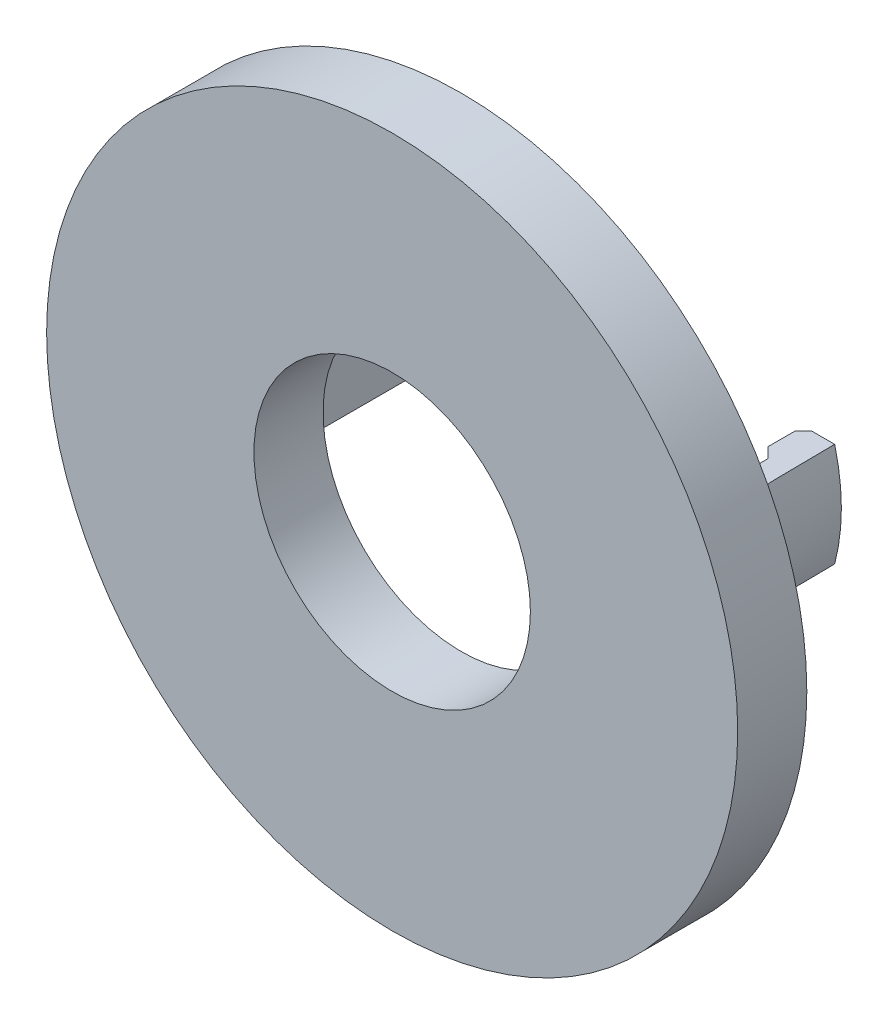
ISO-10303-21;
HEADER;
FILE_DESCRIPTION(('STEP AP214'),'2;1');
FILE_NAME('part.step','',(''),(''),'','','');
FILE_SCHEMA(('AUTOMOTIVE_DESIGN { 1 0 10303 214 1 1 1 1 }'));
ENDSEC;
DATA;
#1=APPLICATION_CONTEXT('core data for automotive mechanical design processes');
#2=APPLICATION_PROTOCOL_DEFINITION('international standard','automotive_design',2000,#1);
#3=PRODUCT_CONTEXT('',#1,'mechanical');
#4=PRODUCT('Part','Part','',(#3));
#5=PRODUCT_RELATED_PRODUCT_CATEGORY('part','',(#4));
#6=PRODUCT_DEFINITION_FORMATION('','',#4);
#7=PRODUCT_DEFINITION_CONTEXT('part definition',#1,'design');
#8=PRODUCT_DEFINITION('design','',#6,#7);
#9=PRODUCT_DEFINITION_SHAPE('','',#8);
#10=(LENGTH_UNIT() NAMED_UNIT(*) SI_UNIT(.MILLI.,.METRE.));
#11=(NAMED_UNIT(*) PLANE_ANGLE_UNIT() SI_UNIT($,.RADIAN.));
#12=(NAMED_UNIT(*) SI_UNIT($,.STERADIAN.) SOLID_ANGLE_UNIT());
#13=UNCERTAINTY_MEASURE_WITH_UNIT(LENGTH_MEASURE(1.E-05),#10,'distance_accuracy_value','');
#14=(GEOMETRIC_REPRESENTATION_CONTEXT(3) GLOBAL_UNCERTAINTY_ASSIGNED_CONTEXT((#13)) GLOBAL_UNIT_ASSIGNED_CONTEXT((#10,
#11,#12)) REPRESENTATION_CONTEXT('',''));
#15=CARTESIAN_POINT('',(0.,0.,0.));
#16=DIRECTION('',(0.,0.,1.));
#17=DIRECTION('',(1.,0.,0.));
#18=AXIS2_PLACEMENT_3D('',#15,#16,#17);
#19=CARTESIAN_POINT('',(0.,0.,0.));
#20=DIRECTION('',(0.,0.,1.));
#21=DIRECTION('',(1.,0.,0.));
#22=AXIS2_PLACEMENT_3D('',#19,#20,#21);
#23=PLANE('',#22);
#24=DIRECTION('',(1.,0.,0.));
#25=VECTOR('',#24,1.);
#26=CARTESIAN_POINT('',(0.,3.75,0.));
#27=LINE('',#26,#25);
#28=CARTESIAN_POINT('',(-15.039531242695,3.75,0.));
#29=VERTEX_POINT('',#28);
#30=CARTESIAN_POINT('',(-10.3535533905933,3.75,0.));
#31=VERTEX_POINT('',#30);
#32=EDGE_CURVE('E160',#29,#31,#27,.T.);
#33=ORIENTED_EDGE('',*,*,#32,.F.);
#34=CARTESIAN_POINT('',(0.,0.,0.));
#35=DIRECTION('',(0.,0.,-1.));
#36=DIRECTION('',(-1.,0.,0.));
#37=AXIS2_PLACEMENT_3D('',#34,#35,#36);
#38=CIRCLE('',#37,15.5);
#39=CARTESIAN_POINT('',(-15.039531242695,-3.75,0.));
#40=VERTEX_POINT('',#39);
#41=EDGE_CURVE('E150',#40,#29,#38,.T.);
#42=ORIENTED_EDGE('',*,*,#41,.F.);
#43=DIRECTION('',(1.,0.,0.));
#44=VECTOR('',#43,1.);
#45=CARTESIAN_POINT('',(0.,-3.75,0.));
#46=LINE('',#45,#44);
#47=CARTESIAN_POINT('',(-10.3535533905933,-3.75,0.));
#48=VERTEX_POINT('',#47);
#49=EDGE_CURVE('E192',#40,#48,#46,.T.);
#50=ORIENTED_EDGE('',*,*,#49,.T.);
#51=DIRECTION('',(0.,1.,0.));
#52=VECTOR('',#51,1.);
#53=CARTESIAN_POINT('',(-10.3535533905933,-3.75,0.));
#54=LINE('',#53,#52);
#55=EDGE_CURVE('E174',#48,#31,#54,.T.);
#56=ORIENTED_EDGE('',*,*,#55,.T.);
#57=EDGE_LOOP('',(#33,#42,#50,#56));
#58=FACE_BOUND('',#57,.T.);
#59=CARTESIAN_POINT('',(0.,0.,0.));
#60=DIRECTION('',(0.,0.,1.));
#61=DIRECTION('',(1.,0.,0.));
#62=AXIS2_PLACEMENT_3D('',#59,#60,#61);
#63=CIRCLE('',#62,15.5);
#64=CARTESIAN_POINT('',(15.039531242695,-3.75,0.));
#65=VERTEX_POINT('',#64);
#66=CARTESIAN_POINT('',(15.039531242695,3.74999999999999,0.));
#67=VERTEX_POINT('',#66);
#68=EDGE_CURVE('E256',#65,#67,#63,.T.);
#69=ORIENTED_EDGE('',*,*,#68,.T.);
#70=DIRECTION('',(-1.,0.,0.));
#71=VECTOR('',#70,1.);
#72=CARTESIAN_POINT('',(0.,3.75,0.));
#73=LINE('',#72,#71);
#74=CARTESIAN_POINT('',(10.3535533905933,3.75,0.));
#75=VERTEX_POINT('',#74);
#76=EDGE_CURVE('E50',#67,#75,#73,.T.);
#77=ORIENTED_EDGE('',*,*,#76,.T.);
#78=DIRECTION('',(0.,1.,0.));
#79=VECTOR('',#78,1.);
#80=CARTESIAN_POINT('',(10.3535533905933,-3.75,0.));
#81=LINE('',#80,#79);
#82=CARTESIAN_POINT('',(10.3535533905933,-3.75,0.));
#83=VERTEX_POINT('',#82);
#84=EDGE_CURVE('E516',#83,#75,#81,.T.);
#85=ORIENTED_EDGE('',*,*,#84,.F.);
#86=DIRECTION('',(-1.,0.,0.));
#87=VECTOR('',#86,1.);
#88=CARTESIAN_POINT('',(0.,-3.75,0.));
#89=LINE('',#88,#87);
#90=EDGE_CURVE('E58',#65,#83,#89,.T.);
#91=ORIENTED_EDGE('',*,*,#90,.F.);
#92=EDGE_LOOP('',(#69,#77,#85,#91));
#93=FACE_BOUND('',#92,.T.);
#94=CARTESIAN_POINT('',(0.,0.,0.));
#95=DIRECTION('',(0.,0.,1.));
#96=DIRECTION('',(1.,0.,0.));
#97=AXIS2_PLACEMENT_3D('',#94,#95,#96);
#98=CIRCLE('',#97,25.);
#99=CARTESIAN_POINT('',(25.,0.,0.));
#100=VERTEX_POINT('',#99);
#101=EDGE_CURVE('E39',#100,#100,#98,.T.);
#102=ORIENTED_EDGE('',*,*,#101,.F.);
#103=EDGE_LOOP('',(#102));
#104=FACE_BOUND('',#103,.T.);
#105=CARTESIAN_POINT('',(0.,0.,0.));
#106=DIRECTION('',(0.,0.,1.));
#107=DIRECTION('',(1.,0.,0.));
#108=AXIS2_PLACEMENT_3D('',#105,#106,#107);
#109=CIRCLE('',#108,10.);
#110=CARTESIAN_POINT('',(10.,0.,0.));
#111=VERTEX_POINT('',#110);
#112=EDGE_CURVE('E509',#111,#111,#109,.T.);
#113=ORIENTED_EDGE('',*,*,#112,.T.);
#114=EDGE_LOOP('',(#113));
#115=FACE_BOUND('',#114,.T.);
#116=ADVANCED_FACE('F35',(#58,#93,#104,#115),#23,.F.);
#117=CARTESIAN_POINT('',(0.,-3.75,-12.75));
#118=DIRECTION('',(0.,0.,1.));
#119=DIRECTION('',(1.,0.,0.));
#120=AXIS2_PLACEMENT_3D('',#117,#118,#119);
#121=PLANE('',#120);
#122=DIRECTION('',(1.,0.,0.));
#123=VECTOR('',#122,1.);
#124=CARTESIAN_POINT('',(0.,3.75,-12.75));
#125=LINE('',#124,#123);
#126=CARTESIAN_POINT('',(12.6035533905933,3.75,-12.75));
#127=VERTEX_POINT('',#126);
#128=CARTESIAN_POINT('',(14.2653426176871,3.75,-12.75));
#129=VERTEX_POINT('',#128);
#130=EDGE_CURVE('E560',#127,#129,#125,.T.);
#131=ORIENTED_EDGE('',*,*,#130,.T.);
#132=CARTESIAN_POINT('',(0.,0.,-12.75));
#133=DIRECTION('',(0.,0.,1.));
#134=DIRECTION('',(1.,0.,0.));
#135=AXIS2_PLACEMENT_3D('',#132,#133,#134);
#136=CIRCLE('',#135,14.75);
#137=CARTESIAN_POINT('',(14.2653426176871,-3.75,-12.75));
#138=VERTEX_POINT('',#137);
#139=EDGE_CURVE('E213',#138,#129,#136,.T.);
#140=ORIENTED_EDGE('',*,*,#139,.F.);
#141=DIRECTION('',(1.,0.,0.));
#142=VECTOR('',#141,1.);
#143=CARTESIAN_POINT('',(0.,-3.75,-12.75));
#144=LINE('',#143,#142);
#145=CARTESIAN_POINT('',(12.6035533905933,-3.75,-12.75));
#146=VERTEX_POINT('',#145);
#147=EDGE_CURVE('E542',#146,#138,#144,.T.);
#148=ORIENTED_EDGE('',*,*,#147,.F.);
#149=DIRECTION('',(0.,1.,0.));
#150=VECTOR('',#149,1.);
#151=CARTESIAN_POINT('',(12.6035533905933,-3.75,-12.75));
#152=LINE('',#151,#150);
#153=EDGE_CURVE('E519',#146,#127,#152,.T.);
#154=ORIENTED_EDGE('',*,*,#153,.T.);
#155=EDGE_LOOP('',(#131,#140,#148,#154));
#156=FACE_BOUND('',#155,.T.);
#157=ADVANCED_FACE('F262',(#156),#121,.F.);
#158=CARTESIAN_POINT('',(0.,-3.75,0.));
#159=DIRECTION('',(0.,1.,0.));
#160=DIRECTION('',(0.,0.,1.));
#161=AXIS2_PLACEMENT_3D('',#158,#159,#160);
#162=PLANE('',#161);
#163=ORIENTED_EDGE('',*,*,#147,.T.);
#164=CARTESIAN_POINT('',(14.2653426176871,-3.75,-12.75));
#165=CARTESIAN_POINT('',(14.2653500910361,-3.75,-12.3961589505586));
#166=CARTESIAN_POINT('',(14.2661845081766,-3.75,-12.0423166032924));
#167=CARTESIAN_POINT('',(14.2697384971241,-3.75,-11.3346108956683));
#168=CARTESIAN_POINT('',(14.2724582324036,-3.75,-10.9807475361491));
#169=CARTESIAN_POINT('',(14.2800143207087,-3.75,-10.273031792079));
#170=CARTESIAN_POINT('',(14.2848507393399,-3.75,-9.91917940820826));
#171=CARTESIAN_POINT('',(14.2969507670398,-3.75,-9.21074937713185));
#172=CARTESIAN_POINT('',(14.3042196059621,-3.75,-8.85617181753099));
#173=CARTESIAN_POINT('',(14.3215540726288,-3.75,-8.14709279050959));
#174=CARTESIAN_POINT('',(14.3316196330507,-3.75,-7.79259132146296));
#175=CARTESIAN_POINT('',(14.355023351933,-3.75,-7.08369823996048));
#176=CARTESIAN_POINT('',(14.3683614684173,-3.75000000000002,-6.72930662615393));
#177=CARTESIAN_POINT('',(14.3913224155745,-3.75000000000001,-6.19733566895319));
#178=CARTESIAN_POINT('',(14.3994822113355,-3.75,-6.01969270757438));
#179=CARTESIAN_POINT('',(14.416887413724,-3.75,-5.66446084663767));
#180=CARTESIAN_POINT('',(14.4261328128766,-3.75,-5.48687194671597));
#181=CARTESIAN_POINT('',(14.4458265073767,-3.75,-5.13176386300203));
#182=CARTESIAN_POINT('',(14.4562747806969,-3.75,-4.95424467799288));
#183=CARTESIAN_POINT('',(14.4785066127611,-3.75,-4.59943269605847));
#184=CARTESIAN_POINT('',(14.4902890921582,-3.75,-4.42213983182587));
#185=CARTESIAN_POINT('',(14.5153663938405,-3.75,-4.06765714667967));
#186=CARTESIAN_POINT('',(14.5286612450936,-3.75,-3.89046732780515));
#187=CARTESIAN_POINT('',(14.5569730697761,-3.75,-3.53621056875449));
#188=CARTESIAN_POINT('',(14.5719901782072,-3.75,-3.35914363930718));
#189=CARTESIAN_POINT('',(14.6040825641808,-3.75,-3.00435025605194));
#190=CARTESIAN_POINT('',(14.6211672480441,-3.75,-2.82662464799028));
#191=CARTESIAN_POINT('',(14.6576747417836,-3.75,-2.4714225262793));
#192=CARTESIAN_POINT('',(14.6770974122446,-3.75,-2.29394599841504));
#193=CARTESIAN_POINT('',(14.7187222990907,-3.75,-1.93934975173721));
#194=CARTESIAN_POINT('',(14.7409240124281,-3.75,-1.7622299742276));
#195=CARTESIAN_POINT('',(14.788741283113,-3.75,-1.4081825944695));
#196=CARTESIAN_POINT('',(14.8143617505427,-3.75,-1.2312556446794));
#197=CARTESIAN_POINT('',(14.855981732399,-3.75,-0.966351657653777));
#198=CARTESIAN_POINT('',(14.8703880138809,-3.75,-0.878123662890955));
#199=CARTESIAN_POINT('',(14.9004113438489,-3.75,-0.70187551981864));
#200=CARTESIAN_POINT('',(14.9160283598067,-3.75,-0.613855365990622));
#201=CARTESIAN_POINT('',(14.9486582378317,-3.75,-0.438000698948808));
#202=CARTESIAN_POINT('',(14.9656721900315,-3.75,-0.350166386652508));
#203=CARTESIAN_POINT('',(15.001324344317,-3.75,-0.174820333453567));
#204=CARTESIAN_POINT('',(15.0199626967413,-3.75,-0.0873086231906706));
#205=CARTESIAN_POINT('',(15.039531242695,-3.75,0.));
#206=B_SPLINE_CURVE_WITH_KNOTS('',3,(#164,#165,#166,#167,#168,#169,#170,#171,#172,#173,#174,
#175,#176,#177,#178,#179,#180,#181,#182,#183,#184,#185,#186,#187,#188,#189,#190,#191,#192,#193,
#194,#195,#196,#197,#198,#199,#200,#201,#202,#203,#204,#205),.UNSPECIFIED.,.F.,.F.,(4,2,2,2,2,2,
2,2,2,2,2,2,2,2,2,2,2,2,2,2,4),(0.,1.06152413863515,2.12314033161648,3.18478943120855,
4.24873596673261,5.31265689318907,6.37656417375401,6.91005229208031,7.44353673731664,
7.97701141479935,8.51005756392753,9.04311392471862,9.5762120985037,10.1118338179439,
10.6474236138006,11.1829165998254,11.7191871198261,11.9873695599756,12.2555447975096,
12.5239313382018,12.7923427445369),.UNSPECIFIED.);
#207=EDGE_CURVE('E251',#138,#65,#206,.T.);
#208=ORIENTED_EDGE('',*,*,#207,.T.);
#209=ORIENTED_EDGE('',*,*,#90,.T.);
#210=DIRECTION('',(-0.707106781186543,0.,0.707106781186552));
#211=VECTOR('',#210,1.);
#212=CARTESIAN_POINT('',(5.1767766952967,-3.75,5.17677669529664));
#213=LINE('',#212,#211);
#214=CARTESIAN_POINT('',(12.75,-3.75,-2.39644660940675));
#215=VERTEX_POINT('',#214);
#216=EDGE_CURVE('E522',#215,#83,#213,.T.);
#217=ORIENTED_EDGE('',*,*,#216,.F.);
#218=DIRECTION('',(0.,0.,1.));
#219=VECTOR('',#218,1.);
#220=CARTESIAN_POINT('',(12.75,-3.75,0.));
#221=LINE('',#220,#219);
#222=CARTESIAN_POINT('',(12.75,-3.75,-9.45710678118655));
#223=VERTEX_POINT('',#222);
#224=EDGE_CURVE('E533',#223,#215,#221,.T.);
#225=ORIENTED_EDGE('',*,*,#224,.F.);
#226=DIRECTION('',(-0.707106781186547,0.,-0.707106781186548));
#227=VECTOR('',#226,1.);
#228=CARTESIAN_POINT('',(11.1035533905933,-3.75,-11.1035533905933));
#229=LINE('',#228,#227);
#230=CARTESIAN_POINT('',(12.,-3.75,-10.2071067811865));
#231=VERTEX_POINT('',#230);
#232=EDGE_CURVE('E536',#223,#231,#229,.T.);
#233=ORIENTED_EDGE('',*,*,#232,.T.);
#234=DIRECTION('',(0.,0.,-1.));
#235=VECTOR('',#234,1.);
#236=CARTESIAN_POINT('',(12.,-3.75,0.));
#237=LINE('',#236,#235);
#238=CARTESIAN_POINT('',(12.,-3.75,-12.1464466094067));
#239=VERTEX_POINT('',#238);
#240=EDGE_CURVE('E538',#231,#239,#237,.T.);
#241=ORIENTED_EDGE('',*,*,#240,.T.);
#242=DIRECTION('',(0.70710678118655,0.,-0.707106781186546));
#243=VECTOR('',#242,1.);
#244=CARTESIAN_POINT('',(-0.0732233047033974,-3.75,-0.0732233047033979));
#245=LINE('',#244,#243);
#246=EDGE_CURVE('E540',#239,#146,#245,.T.);
#247=ORIENTED_EDGE('',*,*,#246,.T.);
#248=EDGE_LOOP('',(#163,#208,#209,#217,#225,#233,#241,#247));
#249=FACE_BOUND('',#248,.T.);
#250=ADVANCED_FACE('F258',(#249),#162,.F.);
#251=CARTESIAN_POINT('',(0.,3.75,0.));
#252=DIRECTION('',(0.,1.,0.));
#253=DIRECTION('',(0.,0.,1.));
#254=AXIS2_PLACEMENT_3D('',#251,#252,#253);
#255=PLANE('',#254);
#256=CARTESIAN_POINT('',(14.2653426176871,3.75,-12.75));
#257=CARTESIAN_POINT('',(14.2653500910361,3.75,-12.3961589505586));
#258=CARTESIAN_POINT('',(14.2661845081766,3.75,-12.0423166032924));
#259=CARTESIAN_POINT('',(14.2697384971241,3.75,-11.3346108956683));
#260=CARTESIAN_POINT('',(14.2724582324036,3.75,-10.9807475361491));
#261=CARTESIAN_POINT('',(14.2800143207087,3.75,-10.273031792079));
#262=CARTESIAN_POINT('',(14.2848507393399,3.75,-9.91917940820826));
#263=CARTESIAN_POINT('',(14.2969507670398,3.75,-9.21074937713185));
#264=CARTESIAN_POINT('',(14.3042196059621,3.75,-8.85617181753099));
#265=CARTESIAN_POINT('',(14.3215540726288,3.75,-8.14709279050959));
#266=CARTESIAN_POINT('',(14.3316196330507,3.75,-7.79259132146296));
#267=CARTESIAN_POINT('',(14.355023351933,3.75,-7.08369823996048));
#268=CARTESIAN_POINT('',(14.3683614684174,3.75,-6.72930662615393));
#269=CARTESIAN_POINT('',(14.3913224155745,3.75,-6.19733566895319));
#270=CARTESIAN_POINT('',(14.3994822113355,3.75,-6.01969270757438));
#271=CARTESIAN_POINT('',(14.416887413724,3.75,-5.66446084663767));
#272=CARTESIAN_POINT('',(14.4261328128766,3.75,-5.48687194671597));
#273=CARTESIAN_POINT('',(14.4458265073767,3.75,-5.13176386300204));
#274=CARTESIAN_POINT('',(14.4562747806969,3.75,-4.95424467799288));
#275=CARTESIAN_POINT('',(14.4785066127611,3.75,-4.59943269605847));
#276=CARTESIAN_POINT('',(14.4902890921582,3.75,-4.42213983182587));
#277=CARTESIAN_POINT('',(14.5153663938405,3.75,-4.06765714667967));
#278=CARTESIAN_POINT('',(14.5286612450936,3.75,-3.89046732780515));
#279=CARTESIAN_POINT('',(14.5569730697761,3.75,-3.53621056875449));
#280=CARTESIAN_POINT('',(14.5719901782072,3.75,-3.35914363930718));
#281=CARTESIAN_POINT('',(14.6040825641808,3.75,-3.00435025605194));
#282=CARTESIAN_POINT('',(14.6211672480441,3.75,-2.82662464799028));
#283=CARTESIAN_POINT('',(14.6576747417836,3.75,-2.4714225262793));
#284=CARTESIAN_POINT('',(14.6770974122446,3.75,-2.29394599841504));
#285=CARTESIAN_POINT('',(14.7187222990907,3.75,-1.93934975173722));
#286=CARTESIAN_POINT('',(14.7409240124281,3.75,-1.7622299742276));
#287=CARTESIAN_POINT('',(14.788741283113,3.75,-1.4081825944695));
#288=CARTESIAN_POINT('',(14.8143617505427,3.75,-1.2312556446794));
#289=CARTESIAN_POINT('',(14.855981732399,3.75,-0.966351657653777));
#290=CARTESIAN_POINT('',(14.8703880138809,3.75,-0.878123662890956));
#291=CARTESIAN_POINT('',(14.9004113438489,3.75,-0.70187551981864));
#292=CARTESIAN_POINT('',(14.9160283598067,3.75,-0.613855365990622));
#293=CARTESIAN_POINT('',(14.9486582378317,3.75,-0.438000698948808));
#294=CARTESIAN_POINT('',(14.9656721900315,3.75,-0.350166386652509));
#295=CARTESIAN_POINT('',(15.001324344317,3.75,-0.174820333453568));
#296=CARTESIAN_POINT('',(15.0199626967413,3.75,-0.0873086231906708));
#297=CARTESIAN_POINT('',(15.039531242695,3.75,0.));
#298=B_SPLINE_CURVE_WITH_KNOTS('',3,(#256,#257,#258,#259,#260,#261,#262,#263,#264,#265,#266,
#267,#268,#269,#270,#271,#272,#273,#274,#275,#276,#277,#278,#279,#280,#281,#282,#283,#284,#285,
#286,#287,#288,#289,#290,#291,#292,#293,#294,#295,#296,#297),.UNSPECIFIED.,.F.,.F.,(4,2,2,2,2,2,
2,2,2,2,2,2,2,2,2,2,2,2,2,2,4),(0.,1.06152413863515,2.12314033161648,3.18478943120855,
4.24873596673261,5.31265689318907,6.37656417375401,6.91005229208031,7.44353673731664,
7.97701141479935,8.51005756392753,9.04311392471862,9.5762120985037,10.1118338179439,
10.6474236138006,11.1829165998254,11.7191871198261,11.9873695599756,12.2555447975096,
12.5239313382018,12.7923427445369),.UNSPECIFIED.);
#299=EDGE_CURVE('E246',#129,#67,#298,.T.);
#300=ORIENTED_EDGE('',*,*,#299,.F.);
#301=ORIENTED_EDGE('',*,*,#130,.F.);
#302=DIRECTION('',(0.70710678118655,0.,-0.707106781186546));
#303=VECTOR('',#302,1.);
#304=CARTESIAN_POINT('',(-0.0732233047033974,3.75,-0.0732233047033979));
#305=LINE('',#304,#303);
#306=CARTESIAN_POINT('',(12.,3.75,-12.1464466094067));
#307=VERTEX_POINT('',#306);
#308=EDGE_CURVE('E557',#307,#127,#305,.T.);
#309=ORIENTED_EDGE('',*,*,#308,.F.);
#310=DIRECTION('',(0.,0.,-1.));
#311=VECTOR('',#310,1.);
#312=CARTESIAN_POINT('',(12.,3.75,0.));
#313=LINE('',#312,#311);
#314=CARTESIAN_POINT('',(12.,3.75,-10.2071067811865));
#315=VERTEX_POINT('',#314);
#316=EDGE_CURVE('E554',#315,#307,#313,.T.);
#317=ORIENTED_EDGE('',*,*,#316,.F.);
#318=DIRECTION('',(-0.707106781186547,0.,-0.707106781186548));
#319=VECTOR('',#318,1.);
#320=CARTESIAN_POINT('',(11.1035533905933,3.75,-11.1035533905933));
#321=LINE('',#320,#319);
#322=CARTESIAN_POINT('',(12.75,3.75,-9.45710678118655));
#323=VERTEX_POINT('',#322);
#324=EDGE_CURVE('E551',#323,#315,#321,.T.);
#325=ORIENTED_EDGE('',*,*,#324,.F.);
#326=DIRECTION('',(0.,0.,1.));
#327=VECTOR('',#326,1.);
#328=CARTESIAN_POINT('',(12.75,3.75,0.));
#329=LINE('',#328,#327);
#330=CARTESIAN_POINT('',(12.75,3.75,-2.39644660940675));
#331=VERTEX_POINT('',#330);
#332=EDGE_CURVE('E548',#323,#331,#329,.T.);
#333=ORIENTED_EDGE('',*,*,#332,.T.);
#334=DIRECTION('',(-0.707106781186543,0.,0.707106781186552));
#335=VECTOR('',#334,1.);
#336=CARTESIAN_POINT('',(5.1767766952967,3.75,5.17677669529664));
#337=LINE('',#336,#335);
#338=EDGE_CURVE('E546',#331,#75,#337,.T.);
#339=ORIENTED_EDGE('',*,*,#338,.T.);
#340=ORIENTED_EDGE('',*,*,#76,.F.);
#341=EDGE_LOOP('',(#300,#301,#309,#317,#325,#333,#339,#340));
#342=FACE_BOUND('',#341,.T.);
#343=ADVANCED_FACE('F242',(#342),#255,.T.);
#344=CARTESIAN_POINT('',(0.,0.,5.));
#345=DIRECTION('',(0.,0.,-1.));
#346=DIRECTION('',(-1.,0.,0.));
#347=AXIS2_PLACEMENT_3D('',#344,#345,#346);
#348=CYLINDRICAL_SURFACE('',#347,25.);
#349=CARTESIAN_POINT('',(0.,0.,5.));
#350=DIRECTION('',(0.,0.,1.));
#351=DIRECTION('',(1.,0.,0.));
#352=AXIS2_PLACEMENT_3D('',#349,#350,#351);
#353=CIRCLE('',#352,25.);
#354=CARTESIAN_POINT('',(25.,0.,5.));
#355=VERTEX_POINT('',#354);
#356=EDGE_CURVE('E11',#355,#355,#353,.T.);
#357=ORIENTED_EDGE('',*,*,#356,.F.);
#358=EDGE_LOOP('',(#357));
#359=FACE_BOUND('',#358,.T.);
#360=ORIENTED_EDGE('',*,*,#101,.T.);
#361=EDGE_LOOP('',(#360));
#362=FACE_BOUND('',#361,.T.);
#363=ADVANCED_FACE('F37',(#359,#362),#348,.T.);
#364=CARTESIAN_POINT('',(0.,0.,5.));
#365=DIRECTION('',(0.,0.,1.));
#366=DIRECTION('',(1.,0.,0.));
#367=AXIS2_PLACEMENT_3D('',#364,#365,#366);
#368=PLANE('',#367);
#369=CARTESIAN_POINT('',(0.,0.,5.));
#370=DIRECTION('',(0.,0.,1.));
#371=DIRECTION('',(1.,0.,0.));
#372=AXIS2_PLACEMENT_3D('',#369,#370,#371);
#373=CIRCLE('',#372,10.);
#374=CARTESIAN_POINT('',(10.,0.,5.));
#375=VERTEX_POINT('',#374);
#376=EDGE_CURVE('E511',#375,#375,#373,.T.);
#377=ORIENTED_EDGE('',*,*,#376,.F.);
#378=EDGE_LOOP('',(#377));
#379=FACE_BOUND('',#378,.T.);
#380=ORIENTED_EDGE('',*,*,#356,.T.);
#381=EDGE_LOOP('',(#380));
#382=FACE_BOUND('',#381,.T.);
#383=ADVANCED_FACE('F288',(#379,#382),#368,.T.);
#384=CARTESIAN_POINT('',(0.,0.,0.));
#385=DIRECTION('',(0.,0.,1.));
#386=DIRECTION('',(1.,0.,0.));
#387=AXIS2_PLACEMENT_3D('',#384,#385,#386);
#388=CYLINDRICAL_SURFACE('',#387,10.);
#389=ORIENTED_EDGE('',*,*,#112,.F.);
#390=EDGE_LOOP('',(#389));
#391=FACE_BOUND('',#390,.T.);
#392=ORIENTED_EDGE('',*,*,#376,.T.);
#393=EDGE_LOOP('',(#392));
#394=FACE_BOUND('',#393,.T.);
#395=ADVANCED_FACE('F267',(#391,#394),#388,.F.);
#396=CARTESIAN_POINT('',(5.1767766952967,-3.75,5.17677669529664));
#397=DIRECTION('',(-0.707106781186552,0.,-0.707106781186543));
#398=DIRECTION('',(-0.707106781186543,0.,0.707106781186552));
#399=AXIS2_PLACEMENT_3D('',#396,#397,#398);
#400=PLANE('',#399);
#401=ORIENTED_EDGE('',*,*,#84,.T.);
#402=ORIENTED_EDGE('',*,*,#338,.F.);
#403=DIRECTION('',(0.,1.,0.));
#404=VECTOR('',#403,1.);
#405=CARTESIAN_POINT('',(12.75,-3.75,-2.39644660940675));
#406=LINE('',#405,#404);
#407=EDGE_CURVE('E528',#215,#331,#406,.T.);
#408=ORIENTED_EDGE('',*,*,#407,.F.);
#409=ORIENTED_EDGE('',*,*,#216,.T.);
#410=EDGE_LOOP('',(#401,#402,#408,#409));
#411=FACE_BOUND('',#410,.T.);
#412=ADVANCED_FACE('F263',(#411),#400,.T.);
#413=CARTESIAN_POINT('',(12.75,-3.75,0.));
#414=DIRECTION('',(-1.,0.,0.));
#415=DIRECTION('',(0.,0.,1.));
#416=AXIS2_PLACEMENT_3D('',#413,#414,#415);
#417=PLANE('',#416);
#418=ORIENTED_EDGE('',*,*,#407,.T.);
#419=ORIENTED_EDGE('',*,*,#332,.F.);
#420=DIRECTION('',(0.,1.,0.));
#421=VECTOR('',#420,1.);
#422=CARTESIAN_POINT('',(12.75,-3.75,-9.45710678118655));
#423=LINE('',#422,#421);
#424=EDGE_CURVE('E526',#223,#323,#423,.T.);
#425=ORIENTED_EDGE('',*,*,#424,.F.);
#426=ORIENTED_EDGE('',*,*,#224,.T.);
#427=EDGE_LOOP('',(#418,#419,#425,#426));
#428=FACE_BOUND('',#427,.T.);
#429=ADVANCED_FACE('F266',(#428),#417,.T.);
#430=CARTESIAN_POINT('',(11.1035533905933,-3.75,-11.1035533905933));
#431=DIRECTION('',(0.707106781186548,0.,-0.707106781186547));
#432=DIRECTION('',(-0.707106781186547,0.,-0.707106781186548));
#433=AXIS2_PLACEMENT_3D('',#430,#431,#432);
#434=PLANE('',#433);
#435=ORIENTED_EDGE('',*,*,#424,.T.);
#436=ORIENTED_EDGE('',*,*,#324,.T.);
#437=DIRECTION('',(0.,1.,0.));
#438=VECTOR('',#437,1.);
#439=CARTESIAN_POINT('',(12.,-3.75,-10.2071067811865));
#440=LINE('',#439,#438);
#441=EDGE_CURVE('E524',#231,#315,#440,.T.);
#442=ORIENTED_EDGE('',*,*,#441,.F.);
#443=ORIENTED_EDGE('',*,*,#232,.F.);
#444=EDGE_LOOP('',(#435,#436,#442,#443));
#445=FACE_BOUND('',#444,.T.);
#446=ADVANCED_FACE('F271',(#445),#434,.F.);
#447=CARTESIAN_POINT('',(12.,-3.75,0.));
#448=DIRECTION('',(1.,0.,0.));
#449=DIRECTION('',(0.,0.,-1.));
#450=AXIS2_PLACEMENT_3D('',#447,#448,#449);
#451=PLANE('',#450);
#452=ORIENTED_EDGE('',*,*,#441,.T.);
#453=ORIENTED_EDGE('',*,*,#316,.T.);
#454=DIRECTION('',(0.,1.,0.));
#455=VECTOR('',#454,1.);
#456=CARTESIAN_POINT('',(12.,-3.75,-12.1464466094067));
#457=LINE('',#456,#455);
#458=EDGE_CURVE('E521',#239,#307,#457,.T.);
#459=ORIENTED_EDGE('',*,*,#458,.F.);
#460=ORIENTED_EDGE('',*,*,#240,.F.);
#461=EDGE_LOOP('',(#452,#453,#459,#460));
#462=FACE_BOUND('',#461,.T.);
#463=ADVANCED_FACE('F275',(#462),#451,.F.);
#464=CARTESIAN_POINT('',(-0.0732233047033974,-3.75,-0.0732233047033979));
#465=DIRECTION('',(0.707106781186545,0.,0.707106781186549));
#466=DIRECTION('',(0.70710678118655,0.,-0.707106781186546));
#467=AXIS2_PLACEMENT_3D('',#464,#465,#466);
#468=PLANE('',#467);
#469=ORIENTED_EDGE('',*,*,#458,.T.);
#470=ORIENTED_EDGE('',*,*,#308,.T.);
#471=ORIENTED_EDGE('',*,*,#153,.F.);
#472=ORIENTED_EDGE('',*,*,#246,.F.);
#473=EDGE_LOOP('',(#469,#470,#471,#472));
#474=FACE_BOUND('',#473,.T.);
#475=ADVANCED_FACE('F238',(#474),#468,.F.);
#476=CARTESIAN_POINT('',(14.75,0.,-12.75));
#477=CARTESIAN_POINT('',(14.75,0.,-3.44644662573699));
#478=CARTESIAN_POINT('',(15.5,0.,0.));
#479=B_SPLINE_CURVE_WITH_KNOTS('',2,(#476,#477,#478),.UNSPECIFIED.,.F.,.F.,(3,3),(0.,1.),.UNSPECIFIED.);
#480=CARTESIAN_POINT('',(0.,0.,0.));
#481=DIRECTION('',(0.,0.,1.));
#482=AXIS1_PLACEMENT('',#480,#481);
#483=SURFACE_OF_REVOLUTION('',#479,#482);
#484=ORIENTED_EDGE('',*,*,#139,.T.);
#485=ORIENTED_EDGE('',*,*,#299,.T.);
#486=ORIENTED_EDGE('',*,*,#68,.F.);
#487=ORIENTED_EDGE('',*,*,#207,.F.);
#488=EDGE_LOOP('',(#484,#485,#486,#487));
#489=FACE_BOUND('',#488,.T.);
#490=ADVANCED_FACE('F232',(#489),#483,.T.);
#491=CARTESIAN_POINT('',(0.,-3.75,-12.75));
#492=DIRECTION('',(0.,0.,-1.));
#493=DIRECTION('',(-1.,0.,0.));
#494=AXIS2_PLACEMENT_3D('',#491,#492,#493);
#495=PLANE('',#494);
#496=CARTESIAN_POINT('',(0.,0.,-12.75));
#497=DIRECTION('',(0.,0.,-1.));
#498=DIRECTION('',(-1.,0.,0.));
#499=AXIS2_PLACEMENT_3D('',#496,#497,#498);
#500=CIRCLE('',#499,14.75);
#501=CARTESIAN_POINT('',(-14.2653426176871,-3.75,-12.75));
#502=VERTEX_POINT('',#501);
#503=CARTESIAN_POINT('',(-14.2653426176871,3.75,-12.75));
#504=VERTEX_POINT('',#503);
#505=EDGE_CURVE('E170',#502,#504,#500,.T.);
#506=ORIENTED_EDGE('',*,*,#505,.T.);
#507=DIRECTION('',(-1.,0.,0.));
#508=VECTOR('',#507,1.);
#509=CARTESIAN_POINT('',(0.,3.75,-12.75));
#510=LINE('',#509,#508);
#511=CARTESIAN_POINT('',(-12.6035533905933,3.75,-12.75));
#512=VERTEX_POINT('',#511);
#513=EDGE_CURVE('E169',#512,#504,#510,.T.);
#514=ORIENTED_EDGE('',*,*,#513,.F.);
#515=DIRECTION('',(0.,1.,0.));
#516=VECTOR('',#515,1.);
#517=CARTESIAN_POINT('',(-12.6035533905933,-3.75,-12.75));
#518=LINE('',#517,#516);
#519=CARTESIAN_POINT('',(-12.6035533905933,-3.75,-12.75));
#520=VERTEX_POINT('',#519);
#521=EDGE_CURVE('E211',#520,#512,#518,.T.);
#522=ORIENTED_EDGE('',*,*,#521,.F.);
#523=DIRECTION('',(-1.,0.,0.));
#524=VECTOR('',#523,1.);
#525=CARTESIAN_POINT('',(0.,-3.75,-12.75));
#526=LINE('',#525,#524);
#527=EDGE_CURVE('E208',#520,#502,#526,.T.);
#528=ORIENTED_EDGE('',*,*,#527,.T.);
#529=EDGE_LOOP('',(#506,#514,#522,#528));
#530=FACE_BOUND('',#529,.T.);
#531=ADVANCED_FACE('F237',(#530),#495,.T.);
#532=CARTESIAN_POINT('',(0.0732233047033974,-3.75,-0.0732233047033979));
#533=DIRECTION('',(0.707106781186545,0.,-0.707106781186549));
#534=DIRECTION('',(-0.70710678118655,0.,-0.707106781186546));
#535=AXIS2_PLACEMENT_3D('',#532,#533,#534);
#536=PLANE('',#535);
#537=ORIENTED_EDGE('',*,*,#521,.T.);
#538=DIRECTION('',(-0.70710678118655,0.,-0.707106781186546));
#539=VECTOR('',#538,1.);
#540=CARTESIAN_POINT('',(0.0732233047033974,3.75,-0.0732233047033979));
#541=LINE('',#540,#539);
#542=CARTESIAN_POINT('',(-12.,3.75,-12.1464466094067));
#543=VERTEX_POINT('',#542);
#544=EDGE_CURVE('E189',#543,#512,#541,.T.);
#545=ORIENTED_EDGE('',*,*,#544,.F.);
#546=DIRECTION('',(0.,1.,0.));
#547=VECTOR('',#546,1.);
#548=CARTESIAN_POINT('',(-12.,-3.75,-12.1464466094067));
#549=LINE('',#548,#547);
#550=CARTESIAN_POINT('',(-12.,-3.75,-12.1464466094067));
#551=VERTEX_POINT('',#550);
#552=EDGE_CURVE('E214',#551,#543,#549,.T.);
#553=ORIENTED_EDGE('',*,*,#552,.F.);
#554=DIRECTION('',(-0.70710678118655,0.,-0.707106781186546));
#555=VECTOR('',#554,1.);
#556=CARTESIAN_POINT('',(0.0732233047033974,-3.75,-0.0732233047033979));
#557=LINE('',#556,#555);
#558=EDGE_CURVE('E205',#551,#520,#557,.T.);
#559=ORIENTED_EDGE('',*,*,#558,.T.);
#560=EDGE_LOOP('',(#537,#545,#553,#559));
#561=FACE_BOUND('',#560,.T.);
#562=ADVANCED_FACE('F353',(#561),#536,.T.);
#563=CARTESIAN_POINT('',(-12.,-3.75,0.));
#564=DIRECTION('',(1.,0.,0.));
#565=DIRECTION('',(0.,0.,-1.));
#566=AXIS2_PLACEMENT_3D('',#563,#564,#565);
#567=PLANE('',#566);
#568=ORIENTED_EDGE('',*,*,#552,.T.);
#569=DIRECTION('',(0.,0.,-1.));
#570=VECTOR('',#569,1.);
#571=CARTESIAN_POINT('',(-12.,3.75,0.));
#572=LINE('',#571,#570);
#573=CARTESIAN_POINT('',(-12.,3.75,-10.2071067811865));
#574=VERTEX_POINT('',#573);
#575=EDGE_CURVE('E186',#574,#543,#572,.T.);
#576=ORIENTED_EDGE('',*,*,#575,.F.);
#577=DIRECTION('',(0.,1.,0.));
#578=VECTOR('',#577,1.);
#579=CARTESIAN_POINT('',(-12.,-3.75,-10.2071067811865));
#580=LINE('',#579,#578);
#581=CARTESIAN_POINT('',(-12.,-3.75,-10.2071067811865));
#582=VERTEX_POINT('',#581);
#583=EDGE_CURVE('E216',#582,#574,#580,.T.);
#584=ORIENTED_EDGE('',*,*,#583,.F.);
#585=DIRECTION('',(0.,0.,-1.));
#586=VECTOR('',#585,1.);
#587=CARTESIAN_POINT('',(-12.,-3.75,0.));
#588=LINE('',#587,#586);
#589=EDGE_CURVE('E202',#582,#551,#588,.T.);
#590=ORIENTED_EDGE('',*,*,#589,.T.);
#591=EDGE_LOOP('',(#568,#576,#584,#590));
#592=FACE_BOUND('',#591,.T.);
#593=ADVANCED_FACE('F361',(#592),#567,.T.);
#594=CARTESIAN_POINT('',(-11.1035533905933,-3.75,-11.1035533905933));
#595=DIRECTION('',(0.707106781186548,0.,0.707106781186547));
#596=DIRECTION('',(0.707106781186547,0.,-0.707106781186548));
#597=AXIS2_PLACEMENT_3D('',#594,#595,#596);
#598=PLANE('',#597);
#599=ORIENTED_EDGE('',*,*,#583,.T.);
#600=DIRECTION('',(0.707106781186547,0.,-0.707106781186548));
#601=VECTOR('',#600,1.);
#602=CARTESIAN_POINT('',(-11.1035533905933,3.75,-11.1035533905933));
#603=LINE('',#602,#601);
#604=CARTESIAN_POINT('',(-12.75,3.75,-9.45710678118655));
#605=VERTEX_POINT('',#604);
#606=EDGE_CURVE('E183',#605,#574,#603,.T.);
#607=ORIENTED_EDGE('',*,*,#606,.F.);
#608=DIRECTION('',(0.,1.,0.));
#609=VECTOR('',#608,1.);
#610=CARTESIAN_POINT('',(-12.75,-3.75,-9.45710678118655));
#611=LINE('',#610,#609);
#612=CARTESIAN_POINT('',(-12.75,-3.75,-9.45710678118655));
#613=VERTEX_POINT('',#612);
#614=EDGE_CURVE('E218',#613,#605,#611,.T.);
#615=ORIENTED_EDGE('',*,*,#614,.F.);
#616=DIRECTION('',(0.707106781186547,0.,-0.707106781186548));
#617=VECTOR('',#616,1.);
#618=CARTESIAN_POINT('',(-11.1035533905933,-3.75,-11.1035533905933));
#619=LINE('',#618,#617);
#620=EDGE_CURVE('E199',#613,#582,#619,.T.);
#621=ORIENTED_EDGE('',*,*,#620,.T.);
#622=EDGE_LOOP('',(#599,#607,#615,#621));
#623=FACE_BOUND('',#622,.T.);
#624=ADVANCED_FACE('F369',(#623),#598,.T.);
#625=CARTESIAN_POINT('',(-12.75,-3.75,0.));
#626=DIRECTION('',(-1.,0.,0.));
#627=DIRECTION('',(0.,0.,1.));
#628=AXIS2_PLACEMENT_3D('',#625,#626,#627);
#629=PLANE('',#628);
#630=ORIENTED_EDGE('',*,*,#614,.T.);
#631=DIRECTION('',(0.,0.,1.));
#632=VECTOR('',#631,1.);
#633=CARTESIAN_POINT('',(-12.75,3.75,0.));
#634=LINE('',#633,#632);
#635=CARTESIAN_POINT('',(-12.75,3.75,-2.39644660940675));
#636=VERTEX_POINT('',#635);
#637=EDGE_CURVE('E177',#605,#636,#634,.T.);
#638=ORIENTED_EDGE('',*,*,#637,.T.);
#639=DIRECTION('',(0.,1.,0.));
#640=VECTOR('',#639,1.);
#641=CARTESIAN_POINT('',(-12.75,-3.75,-2.39644660940675));
#642=LINE('',#641,#640);
#643=CARTESIAN_POINT('',(-12.75,-3.75,-2.39644660940675));
#644=VERTEX_POINT('',#643);
#645=EDGE_CURVE('E220',#644,#636,#642,.T.);
#646=ORIENTED_EDGE('',*,*,#645,.F.);
#647=DIRECTION('',(0.,0.,1.));
#648=VECTOR('',#647,1.);
#649=CARTESIAN_POINT('',(-12.75,-3.75,0.));
#650=LINE('',#649,#648);
#651=EDGE_CURVE('E197',#613,#644,#650,.T.);
#652=ORIENTED_EDGE('',*,*,#651,.F.);
#653=EDGE_LOOP('',(#630,#638,#646,#652));
#654=FACE_BOUND('',#653,.T.);
#655=ADVANCED_FACE('F377',(#654),#629,.F.);
#656=CARTESIAN_POINT('',(-5.1767766952967,-3.75,5.17677669529664));
#657=DIRECTION('',(-0.707106781186552,0.,0.707106781186543));
#658=DIRECTION('',(0.707106781186543,0.,0.707106781186552));
#659=AXIS2_PLACEMENT_3D('',#656,#657,#658);
#660=PLANE('',#659);
#661=ORIENTED_EDGE('',*,*,#645,.T.);
#662=DIRECTION('',(0.707106781186543,0.,0.707106781186552));
#663=VECTOR('',#662,1.);
#664=CARTESIAN_POINT('',(-5.1767766952967,3.75,5.17677669529664));
#665=LINE('',#664,#663);
#666=EDGE_CURVE('E175',#636,#31,#665,.T.);
#667=ORIENTED_EDGE('',*,*,#666,.T.);
#668=ORIENTED_EDGE('',*,*,#55,.F.);
#669=DIRECTION('',(0.707106781186543,0.,0.707106781186552));
#670=VECTOR('',#669,1.);
#671=CARTESIAN_POINT('',(-5.1767766952967,-3.75,5.17677669529664));
#672=LINE('',#671,#670);
#673=EDGE_CURVE('E194',#644,#48,#672,.T.);
#674=ORIENTED_EDGE('',*,*,#673,.F.);
#675=EDGE_LOOP('',(#661,#667,#668,#674));
#676=FACE_BOUND('',#675,.T.);
#677=ADVANCED_FACE('F240',(#676),#660,.F.);
#678=CARTESIAN_POINT('',(0.,-3.75,0.));
#679=DIRECTION('',(0.,1.,0.));
#680=DIRECTION('',(0.,0.,1.));
#681=AXIS2_PLACEMENT_3D('',#678,#679,#680);
#682=PLANE('',#681);
#683=ORIENTED_EDGE('',*,*,#49,.F.);
#684=CARTESIAN_POINT('',(-15.039531242695,-3.75,0.));
#685=CARTESIAN_POINT('',(-15.020327808997,-3.75,-0.0856768343813817));
#686=CARTESIAN_POINT('',(-15.0020208567689,-3.75,-0.171549555333694));
#687=CARTESIAN_POINT('',(-14.9669757403122,-3.75,-0.343607294974954));
#688=CARTESIAN_POINT('',(-14.9502374367506,-3.75,-0.429792285219369));
#689=CARTESIAN_POINT('',(-14.9181147103926,-3.75,-0.602342654892972));
#690=CARTESIAN_POINT('',(-14.9027292360249,-3.75,-0.688707839823807));
#691=CARTESIAN_POINT('',(-14.8731328458083,-3.75,-0.861640717373805));
#692=CARTESIAN_POINT('',(-14.8589219602376,-3.75,-0.948208415154162));
#693=CARTESIAN_POINT('',(-14.8178434518177,-3.75,-1.20812557422113));
#694=CARTESIAN_POINT('',(-14.7925242629049,-3.75,-1.38172040070915));
#695=CARTESIAN_POINT('',(-14.7452234462389,-3.75,-1.7290979200274));
#696=CARTESIAN_POINT('',(-14.7232369807695,-3.75,-1.90287996451987));
#697=CARTESIAN_POINT('',(-14.6819768374602,-3.75,-2.25079662308398));
#698=CARTESIAN_POINT('',(-14.6627036628651,-3.75,-2.42493129649968));
#699=CARTESIAN_POINT('',(-14.6264446897939,-3.75,-2.77344989653936));
#700=CARTESIAN_POINT('',(-14.6094590654158,-3.75,-2.94783384111498));
#701=CARTESIAN_POINT('',(-14.5690351181335,-3.75,-3.38842921424573));
#702=CARTESIAN_POINT('',(-14.5468940207504,-3.75,-3.65475959601803));
#703=CARTESIAN_POINT('',(-14.5062960076141,-3.75,-4.18767956093514));
#704=CARTESIAN_POINT('',(-14.4878388639286,-3.75,-4.45426912701757));
#705=CARTESIAN_POINT('',(-14.4539905421145,-3.75,-4.98763926648912));
#706=CARTESIAN_POINT('',(-14.4385993418057,-3.75,-5.2544198384824));
#707=CARTESIAN_POINT('',(-14.4104020019367,-3.75,-5.7884053467958));
#708=CARTESIAN_POINT('',(-14.3975986750394,-3.75,-6.0556104300912));
#709=CARTESIAN_POINT('',(-14.3742380988995,-3.75,-6.59011866635651));
#710=CARTESIAN_POINT('',(-14.3636808561011,-3.75,-6.85742181960559));
#711=CARTESIAN_POINT('',(-14.3445277708221,-3.75,-7.39209832563643));
#712=CARTESIAN_POINT('',(-14.3359319325189,-3.75,-7.65947167856647));
#713=CARTESIAN_POINT('',(-14.3204512478924,-3.75,-8.1949889661761));
#714=CARTESIAN_POINT('',(-14.3135710772393,-3.75,-8.4631330348267));
#715=CARTESIAN_POINT('',(-14.3013621418216,-3.75,-8.99945510588886));
#716=CARTESIAN_POINT('',(-14.2960333709933,-3.75,-9.26763310816369));
#717=CARTESIAN_POINT('',(-14.2867692688425,-3.75,-9.80401386273562));
#718=CARTESIAN_POINT('',(-14.2828339423778,-3.75,-10.0722166151157));
#719=CARTESIAN_POINT('',(-14.2762300466706,-3.75,-10.6081460093801));
#720=CARTESIAN_POINT('',(-14.2735591694586,-3.75,-10.8758726231568));
#721=CARTESIAN_POINT('',(-14.2693601747839,-3.75,-11.4113332583587));
#722=CARTESIAN_POINT('',(-14.2678320515148,-3.75,-11.6790672797393));
#723=CARTESIAN_POINT('',(-14.2658244306281,-3.75,-12.2145343311076));
#724=CARTESIAN_POINT('',(-14.2653449134892,-3.75,-12.482267361021));
#725=CARTESIAN_POINT('',(-14.2653426176871,-3.75,-12.75));
#726=B_SPLINE_CURVE_WITH_KNOTS('',3,(#684,#685,#686,#687,#688,#689,#690,#691,#692,#693,#694,
#695,#696,#697,#698,#699,#700,#701,#702,#703,#704,#705,#706,#707,#708,#709,#710,#711,#712,#713,
#714,#715,#716,#717,#718,#719,#720,#721,#722,#723,#724,#725),.UNSPECIFIED.,.F.,.F.,(4,2,2,2,2,2,
2,2,2,2,2,2,2,2,2,2,2,2,2,2,4),(0.,0.263395759297805,0.526768100626944,0.789933875318817,
1.05310643169289,1.57935612102938,2.10483444663265,2.63041010671912,3.15602574405627,
3.95773866333468,4.75940196388561,5.56105946464932,6.36358362655405,7.16611009094316,
7.96863826447412,8.77333021732099,9.57801902499108,10.3827106379532,11.1859277487383,
11.9891407782493,12.7923388545549),.UNSPECIFIED.);
#727=EDGE_CURVE('E156',#40,#502,#726,.T.);
#728=ORIENTED_EDGE('',*,*,#727,.T.);
#729=ORIENTED_EDGE('',*,*,#527,.F.);
#730=ORIENTED_EDGE('',*,*,#558,.F.);
#731=ORIENTED_EDGE('',*,*,#589,.F.);
#732=ORIENTED_EDGE('',*,*,#620,.F.);
#733=ORIENTED_EDGE('',*,*,#651,.T.);
#734=ORIENTED_EDGE('',*,*,#673,.T.);
#735=EDGE_LOOP('',(#683,#728,#729,#730,#731,#732,#733,#734));
#736=FACE_BOUND('',#735,.T.);
#737=ADVANCED_FACE('F391',(#736),#682,.F.);
#738=CARTESIAN_POINT('',(0.,3.75,0.));
#739=DIRECTION('',(0.,1.,0.));
#740=DIRECTION('',(0.,0.,1.));
#741=AXIS2_PLACEMENT_3D('',#738,#739,#740);
#742=PLANE('',#741);
#743=CARTESIAN_POINT('',(-15.039531242695,3.75,0.));
#744=CARTESIAN_POINT('',(-15.020327808997,3.75,-0.0856768343813817));
#745=CARTESIAN_POINT('',(-15.0020208567689,3.75,-0.171549555333694));
#746=CARTESIAN_POINT('',(-14.9669757403122,3.75,-0.343607294974954));
#747=CARTESIAN_POINT('',(-14.9502374367506,3.75,-0.429792285219369));
#748=CARTESIAN_POINT('',(-14.9181147103926,3.75,-0.602342654892972));
#749=CARTESIAN_POINT('',(-14.9027292360249,3.75,-0.688707839823807));
#750=CARTESIAN_POINT('',(-14.8731328458083,3.75,-0.861640717373805));
#751=CARTESIAN_POINT('',(-14.8589219602376,3.75,-0.948208415154162));
#752=CARTESIAN_POINT('',(-14.8178434518177,3.75,-1.20812557422113));
#753=CARTESIAN_POINT('',(-14.7925242629049,3.75,-1.38172040070915));
#754=CARTESIAN_POINT('',(-14.7452234462389,3.75,-1.7290979200274));
#755=CARTESIAN_POINT('',(-14.7232369807695,3.75,-1.90287996451987));
#756=CARTESIAN_POINT('',(-14.6819768374602,3.75,-2.25079662308398));
#757=CARTESIAN_POINT('',(-14.6627036628651,3.75,-2.42493129649968));
#758=CARTESIAN_POINT('',(-14.6264446897939,3.75,-2.77344989653936));
#759=CARTESIAN_POINT('',(-14.6094590654158,3.75,-2.94783384111498));
#760=CARTESIAN_POINT('',(-14.5690351181335,3.75,-3.38842921424573));
#761=CARTESIAN_POINT('',(-14.5468940207504,3.75,-3.65475959601803));
#762=CARTESIAN_POINT('',(-14.5062960076141,3.75,-4.18767956093514));
#763=CARTESIAN_POINT('',(-14.4878388639286,3.75,-4.45426912701757));
#764=CARTESIAN_POINT('',(-14.4539905421145,3.75,-4.98763926648912));
#765=CARTESIAN_POINT('',(-14.4385993418057,3.75,-5.2544198384824));
#766=CARTESIAN_POINT('',(-14.4104020019367,3.75,-5.7884053467958));
#767=CARTESIAN_POINT('',(-14.3975986750394,3.75,-6.0556104300912));
#768=CARTESIAN_POINT('',(-14.3742380988995,3.75,-6.59011866635651));
#769=CARTESIAN_POINT('',(-14.3636808561011,3.75,-6.85742181960559));
#770=CARTESIAN_POINT('',(-14.3445277708221,3.75,-7.39209832563643));
#771=CARTESIAN_POINT('',(-14.3359319325189,3.75000000000001,-7.65947167856647));
#772=CARTESIAN_POINT('',(-14.3204512478924,3.75000000000001,-8.1949889661761));
#773=CARTESIAN_POINT('',(-14.3135710772393,3.75,-8.4631330348267));
#774=CARTESIAN_POINT('',(-14.3013621418216,3.75,-8.99945510588886));
#775=CARTESIAN_POINT('',(-14.2960333709933,3.75,-9.26763310816369));
#776=CARTESIAN_POINT('',(-14.2867692688425,3.75,-9.80401386273562));
#777=CARTESIAN_POINT('',(-14.2828339423778,3.75,-10.0722166151157));
#778=CARTESIAN_POINT('',(-14.2762300466706,3.75,-10.6081460093801));
#779=CARTESIAN_POINT('',(-14.2735591694586,3.75,-10.8758726231568));
#780=CARTESIAN_POINT('',(-14.2693601747839,3.75,-11.4113332583587));
#781=CARTESIAN_POINT('',(-14.2678320515148,3.75,-11.6790672797393));
#782=CARTESIAN_POINT('',(-14.2658244306281,3.75,-12.2145343311076));
#783=CARTESIAN_POINT('',(-14.2653449134892,3.75,-12.482267361021));
#784=CARTESIAN_POINT('',(-14.2653426176871,3.75,-12.75));
#785=B_SPLINE_CURVE_WITH_KNOTS('',3,(#743,#744,#745,#746,#747,#748,#749,#750,#751,#752,#753,
#754,#755,#756,#757,#758,#759,#760,#761,#762,#763,#764,#765,#766,#767,#768,#769,#770,#771,#772,
#773,#774,#775,#776,#777,#778,#779,#780,#781,#782,#783,#784),.UNSPECIFIED.,.F.,.F.,(4,2,2,2,2,2,
2,2,2,2,2,2,2,2,2,2,2,2,2,2,4),(0.,0.263395759297805,0.526768100626944,0.789933875318817,
1.05310643169289,1.57935612102938,2.10483444663265,2.63041010671912,3.15602574405627,
3.95773866333468,4.75940196388561,5.56105946464932,6.36358362655405,7.16611009094316,
7.96863826447412,8.77333021732099,9.57801902499108,10.3827106379532,11.1859277487383,
11.9891407782493,12.7923388545549),.UNSPECIFIED.);
#786=EDGE_CURVE('E153',#29,#504,#785,.T.);
#787=ORIENTED_EDGE('',*,*,#786,.F.);
#788=ORIENTED_EDGE('',*,*,#32,.T.);
#789=ORIENTED_EDGE('',*,*,#666,.F.);
#790=ORIENTED_EDGE('',*,*,#637,.F.);
#791=ORIENTED_EDGE('',*,*,#606,.T.);
#792=ORIENTED_EDGE('',*,*,#575,.T.);
#793=ORIENTED_EDGE('',*,*,#544,.T.);
#794=ORIENTED_EDGE('',*,*,#513,.T.);
#795=EDGE_LOOP('',(#787,#788,#789,#790,#791,#792,#793,#794));
#796=FACE_BOUND('',#795,.T.);
#797=ADVANCED_FACE('F164',(#796),#742,.T.);
#798=CARTESIAN_POINT('',(-14.75,0.,-12.75));
#799=CARTESIAN_POINT('',(-14.75,0.,-3.44644662573699));
#800=CARTESIAN_POINT('',(-15.5,0.,0.));
#801=B_SPLINE_CURVE_WITH_KNOTS('',2,(#798,#799,#800),.UNSPECIFIED.,.F.,.F.,(3,3),(0.,1.),.UNSPECIFIED.);
#802=CARTESIAN_POINT('',(0.,0.,0.));
#803=DIRECTION('',(0.,0.,1.));
#804=AXIS1_PLACEMENT('',#802,#803);
#805=SURFACE_OF_REVOLUTION('',#801,#804);
#806=ORIENTED_EDGE('',*,*,#41,.T.);
#807=ORIENTED_EDGE('',*,*,#786,.T.);
#808=ORIENTED_EDGE('',*,*,#505,.F.);
#809=ORIENTED_EDGE('',*,*,#727,.F.);
#810=EDGE_LOOP('',(#806,#807,#808,#809));
#811=FACE_BOUND('',#810,.T.);
#812=ADVANCED_FACE('F152',(#811),#805,.T.);
#813=CLOSED_SHELL('',(#116,#157,#250,#343,#363,#383,#395,#412,#429,#446,#463,#475,#490,#531,
#562,#593,#624,#655,#677,#737,#797,#812));
#814=MANIFOLD_SOLID_BREP('B2',#813);
#815=ADVANCED_BREP_SHAPE_REPRESENTATION('',(#18,#814),#14);
#816=SHAPE_DEFINITION_REPRESENTATION(#9,#815);
ENDSEC;
END-ISO-10303-21;
